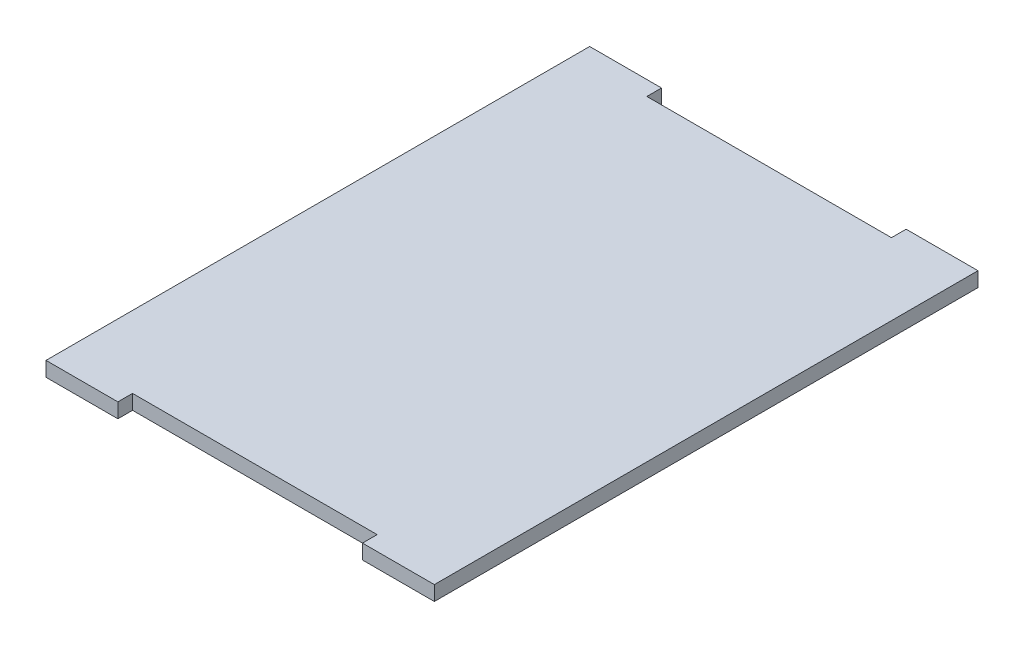
ISO-10303-21;
HEADER;
FILE_DESCRIPTION(('STEP AP214'),'2;1');
FILE_NAME('part.step','',(''),(''),'','','');
FILE_SCHEMA(('AUTOMOTIVE_DESIGN { 1 0 10303 214 1 1 1 1 }'));
ENDSEC;
DATA;
#1=APPLICATION_CONTEXT('core data for automotive mechanical design processes');
#2=APPLICATION_PROTOCOL_DEFINITION('international standard','automotive_design',2000,#1);
#3=PRODUCT_CONTEXT('',#1,'mechanical');
#4=PRODUCT('Part','Part','',(#3));
#5=PRODUCT_RELATED_PRODUCT_CATEGORY('part','',(#4));
#6=PRODUCT_DEFINITION_FORMATION('','',#4);
#7=PRODUCT_DEFINITION_CONTEXT('part definition',#1,'design');
#8=PRODUCT_DEFINITION('design','',#6,#7);
#9=PRODUCT_DEFINITION_SHAPE('','',#8);
#10=(LENGTH_UNIT() NAMED_UNIT(*) SI_UNIT(.MILLI.,.METRE.));
#11=(NAMED_UNIT(*) PLANE_ANGLE_UNIT() SI_UNIT($,.RADIAN.));
#12=(NAMED_UNIT(*) SI_UNIT($,.STERADIAN.) SOLID_ANGLE_UNIT());
#13=UNCERTAINTY_MEASURE_WITH_UNIT(LENGTH_MEASURE(1.E-05),#10,'distance_accuracy_value','');
#14=(GEOMETRIC_REPRESENTATION_CONTEXT(3) GLOBAL_UNCERTAINTY_ASSIGNED_CONTEXT((#13)) GLOBAL_UNIT_ASSIGNED_CONTEXT((#10,
#11,#12)) REPRESENTATION_CONTEXT('',''));
#15=CARTESIAN_POINT('',(0.,0.,0.));
#16=DIRECTION('',(0.,0.,1.));
#17=DIRECTION('',(1.,0.,0.));
#18=AXIS2_PLACEMENT_3D('',#15,#16,#17);
#19=CARTESIAN_POINT('',(25.,3.,-55.565));
#20=DIRECTION('',(0.,0.,1.));
#21=DIRECTION('',(1.,0.,0.));
#22=AXIS2_PLACEMENT_3D('',#19,#20,#21);
#23=PLANE('',#22);
#24=DIRECTION('',(-1.,0.,0.));
#25=VECTOR('',#24,1.);
#26=CARTESIAN_POINT('',(25.,0.,-55.565));
#27=LINE('',#26,#25);
#28=CARTESIAN_POINT('',(39.69,0.,-55.565));
#29=VERTEX_POINT('',#28);
#30=CARTESIAN_POINT('',(25.,0.,-55.565));
#31=VERTEX_POINT('',#30);
#32=EDGE_CURVE('E152',#29,#31,#27,.T.);
#33=ORIENTED_EDGE('',*,*,#32,.T.);
#34=DIRECTION('',(0.,-1.,0.));
#35=VECTOR('',#34,1.);
#36=CARTESIAN_POINT('',(25.,3.,-55.565));
#37=LINE('',#36,#35);
#38=CARTESIAN_POINT('',(25.,3.,-55.565));
#39=VERTEX_POINT('',#38);
#40=EDGE_CURVE('E11',#39,#31,#37,.T.);
#41=ORIENTED_EDGE('',*,*,#40,.F.);
#42=DIRECTION('',(-1.,0.,0.));
#43=VECTOR('',#42,1.);
#44=CARTESIAN_POINT('',(25.,3.,-55.565));
#45=LINE('',#44,#43);
#46=CARTESIAN_POINT('',(39.69,3.,-55.565));
#47=VERTEX_POINT('',#46);
#48=EDGE_CURVE('E174',#47,#39,#45,.T.);
#49=ORIENTED_EDGE('',*,*,#48,.F.);
#50=DIRECTION('',(0.,-1.,0.));
#51=VECTOR('',#50,1.);
#52=CARTESIAN_POINT('',(39.69,3.,-55.565));
#53=LINE('',#52,#51);
#54=EDGE_CURVE('E148',#47,#29,#53,.T.);
#55=ORIENTED_EDGE('',*,*,#54,.T.);
#56=EDGE_LOOP('',(#33,#41,#49,#55));
#57=FACE_BOUND('',#56,.T.);
#58=ADVANCED_FACE('F32',(#57),#23,.F.);
#59=CARTESIAN_POINT('',(25.,3.,-52.565));
#60=DIRECTION('',(1.,0.,0.));
#61=DIRECTION('',(0.,0.,-1.));
#62=AXIS2_PLACEMENT_3D('',#59,#60,#61);
#63=PLANE('',#62);
#64=DIRECTION('',(0.,0.,1.));
#65=VECTOR('',#64,1.);
#66=CARTESIAN_POINT('',(25.,0.,-52.565));
#67=LINE('',#66,#65);
#68=CARTESIAN_POINT('',(25.,0.,-52.565));
#69=VERTEX_POINT('',#68);
#70=EDGE_CURVE('E155',#31,#69,#67,.T.);
#71=ORIENTED_EDGE('',*,*,#70,.T.);
#72=DIRECTION('',(0.,-1.,0.));
#73=VECTOR('',#72,1.);
#74=CARTESIAN_POINT('',(25.,3.,-52.565));
#75=LINE('',#74,#73);
#76=CARTESIAN_POINT('',(25.,3.,-52.565));
#77=VERTEX_POINT('',#76);
#78=EDGE_CURVE('E40',#77,#69,#75,.T.);
#79=ORIENTED_EDGE('',*,*,#78,.F.);
#80=DIRECTION('',(0.,0.,1.));
#81=VECTOR('',#80,1.);
#82=CARTESIAN_POINT('',(25.,3.,-52.565));
#83=LINE('',#82,#81);
#84=EDGE_CURVE('E103',#39,#77,#83,.T.);
#85=ORIENTED_EDGE('',*,*,#84,.F.);
#86=ORIENTED_EDGE('',*,*,#40,.T.);
#87=EDGE_LOOP('',(#71,#79,#85,#86));
#88=FACE_BOUND('',#87,.T.);
#89=ADVANCED_FACE('F252',(#88),#63,.F.);
#90=CARTESIAN_POINT('',(-25.,3.,-52.565));
#91=DIRECTION('',(0.,0.,1.));
#92=DIRECTION('',(1.,0.,0.));
#93=AXIS2_PLACEMENT_3D('',#90,#91,#92);
#94=PLANE('',#93);
#95=DIRECTION('',(-1.,0.,0.));
#96=VECTOR('',#95,1.);
#97=CARTESIAN_POINT('',(-25.,0.,-52.565));
#98=LINE('',#97,#96);
#99=CARTESIAN_POINT('',(-25.,0.,-52.565));
#100=VERTEX_POINT('',#99);
#101=EDGE_CURVE('E157',#69,#100,#98,.T.);
#102=ORIENTED_EDGE('',*,*,#101,.T.);
#103=DIRECTION('',(0.,-1.,0.));
#104=VECTOR('',#103,1.);
#105=CARTESIAN_POINT('',(-25.,3.,-52.565));
#106=LINE('',#105,#104);
#107=CARTESIAN_POINT('',(-25.,3.,-52.565));
#108=VERTEX_POINT('',#107);
#109=EDGE_CURVE('E193',#108,#100,#106,.T.);
#110=ORIENTED_EDGE('',*,*,#109,.F.);
#111=DIRECTION('',(-1.,0.,0.));
#112=VECTOR('',#111,1.);
#113=CARTESIAN_POINT('',(-25.,3.,-52.565));
#114=LINE('',#113,#112);
#115=EDGE_CURVE('E201',#77,#108,#114,.T.);
#116=ORIENTED_EDGE('',*,*,#115,.F.);
#117=ORIENTED_EDGE('',*,*,#78,.T.);
#118=EDGE_LOOP('',(#102,#110,#116,#117));
#119=FACE_BOUND('',#118,.T.);
#120=ADVANCED_FACE('F199',(#119),#94,.F.);
#121=CARTESIAN_POINT('',(-25.,3.,-55.565));
#122=DIRECTION('',(-1.,0.,0.));
#123=DIRECTION('',(0.,0.,1.));
#124=AXIS2_PLACEMENT_3D('',#121,#122,#123);
#125=PLANE('',#124);
#126=DIRECTION('',(0.,0.,-1.));
#127=VECTOR('',#126,1.);
#128=CARTESIAN_POINT('',(-25.,0.,-55.565));
#129=LINE('',#128,#127);
#130=CARTESIAN_POINT('',(-25.,0.,-55.565));
#131=VERTEX_POINT('',#130);
#132=EDGE_CURVE('E159',#100,#131,#129,.T.);
#133=ORIENTED_EDGE('',*,*,#132,.T.);
#134=DIRECTION('',(0.,-1.,0.));
#135=VECTOR('',#134,1.);
#136=CARTESIAN_POINT('',(-25.,3.,-55.565));
#137=LINE('',#136,#135);
#138=CARTESIAN_POINT('',(-25.,3.,-55.565));
#139=VERTEX_POINT('',#138);
#140=EDGE_CURVE('E190',#139,#131,#137,.T.);
#141=ORIENTED_EDGE('',*,*,#140,.F.);
#142=DIRECTION('',(0.,0.,-1.));
#143=VECTOR('',#142,1.);
#144=CARTESIAN_POINT('',(-25.,3.,-55.565));
#145=LINE('',#144,#143);
#146=EDGE_CURVE('E219',#108,#139,#145,.T.);
#147=ORIENTED_EDGE('',*,*,#146,.F.);
#148=ORIENTED_EDGE('',*,*,#109,.T.);
#149=EDGE_LOOP('',(#133,#141,#147,#148));
#150=FACE_BOUND('',#149,.T.);
#151=ADVANCED_FACE('F210',(#150),#125,.F.);
#152=CARTESIAN_POINT('',(-39.69,3.,-55.565));
#153=DIRECTION('',(0.,0.,1.));
#154=DIRECTION('',(1.,0.,0.));
#155=AXIS2_PLACEMENT_3D('',#152,#153,#154);
#156=PLANE('',#155);
#157=DIRECTION('',(-1.,0.,0.));
#158=VECTOR('',#157,1.);
#159=CARTESIAN_POINT('',(-39.69,0.,-55.565));
#160=LINE('',#159,#158);
#161=CARTESIAN_POINT('',(-39.69,0.,-55.565));
#162=VERTEX_POINT('',#161);
#163=EDGE_CURVE('E161',#131,#162,#160,.T.);
#164=ORIENTED_EDGE('',*,*,#163,.T.);
#165=DIRECTION('',(0.,-1.,0.));
#166=VECTOR('',#165,1.);
#167=CARTESIAN_POINT('',(-39.69,3.,-55.565));
#168=LINE('',#167,#166);
#169=CARTESIAN_POINT('',(-39.69,3.,-55.565));
#170=VERTEX_POINT('',#169);
#171=EDGE_CURVE('E187',#170,#162,#168,.T.);
#172=ORIENTED_EDGE('',*,*,#171,.F.);
#173=DIRECTION('',(-1.,0.,0.));
#174=VECTOR('',#173,1.);
#175=CARTESIAN_POINT('',(-39.69,3.,-55.565));
#176=LINE('',#175,#174);
#177=EDGE_CURVE('E216',#139,#170,#176,.T.);
#178=ORIENTED_EDGE('',*,*,#177,.F.);
#179=ORIENTED_EDGE('',*,*,#140,.T.);
#180=EDGE_LOOP('',(#164,#172,#178,#179));
#181=FACE_BOUND('',#180,.T.);
#182=ADVANCED_FACE('F214',(#181),#156,.F.);
#183=CARTESIAN_POINT('',(-39.69,3.,55.565));
#184=DIRECTION('',(1.,0.,0.));
#185=DIRECTION('',(0.,0.,-1.));
#186=AXIS2_PLACEMENT_3D('',#183,#184,#185);
#187=PLANE('',#186);
#188=DIRECTION('',(0.,0.,1.));
#189=VECTOR('',#188,1.);
#190=CARTESIAN_POINT('',(-39.69,0.,55.565));
#191=LINE('',#190,#189);
#192=CARTESIAN_POINT('',(-39.69,0.,55.565));
#193=VERTEX_POINT('',#192);
#194=EDGE_CURVE('E163',#162,#193,#191,.T.);
#195=ORIENTED_EDGE('',*,*,#194,.T.);
#196=DIRECTION('',(0.,-1.,0.));
#197=VECTOR('',#196,1.);
#198=CARTESIAN_POINT('',(-39.69,3.,55.565));
#199=LINE('',#198,#197);
#200=CARTESIAN_POINT('',(-39.69,3.,55.565));
#201=VERTEX_POINT('',#200);
#202=EDGE_CURVE('E184',#201,#193,#199,.T.);
#203=ORIENTED_EDGE('',*,*,#202,.F.);
#204=DIRECTION('',(0.,0.,1.));
#205=VECTOR('',#204,1.);
#206=CARTESIAN_POINT('',(-39.69,3.,55.565));
#207=LINE('',#206,#205);
#208=EDGE_CURVE('E218',#170,#201,#207,.T.);
#209=ORIENTED_EDGE('',*,*,#208,.F.);
#210=ORIENTED_EDGE('',*,*,#171,.T.);
#211=EDGE_LOOP('',(#195,#203,#209,#210));
#212=FACE_BOUND('',#211,.T.);
#213=ADVANCED_FACE('F265',(#212),#187,.F.);
#214=CARTESIAN_POINT('',(-39.69,3.,55.565));
#215=DIRECTION('',(0.,0.,-1.));
#216=DIRECTION('',(-1.,0.,0.));
#217=AXIS2_PLACEMENT_3D('',#214,#215,#216);
#218=PLANE('',#217);
#219=DIRECTION('',(1.,0.,0.));
#220=VECTOR('',#219,1.);
#221=CARTESIAN_POINT('',(-39.69,0.,55.565));
#222=LINE('',#221,#220);
#223=CARTESIAN_POINT('',(-25.,0.,55.565));
#224=VERTEX_POINT('',#223);
#225=EDGE_CURVE('E165',#193,#224,#222,.T.);
#226=ORIENTED_EDGE('',*,*,#225,.T.);
#227=DIRECTION('',(0.,-1.,0.));
#228=VECTOR('',#227,1.);
#229=CARTESIAN_POINT('',(-25.,3.,55.565));
#230=LINE('',#229,#228);
#231=CARTESIAN_POINT('',(-25.,3.,55.565));
#232=VERTEX_POINT('',#231);
#233=EDGE_CURVE('E181',#232,#224,#230,.T.);
#234=ORIENTED_EDGE('',*,*,#233,.F.);
#235=DIRECTION('',(1.,0.,0.));
#236=VECTOR('',#235,1.);
#237=CARTESIAN_POINT('',(-39.69,3.,55.565));
#238=LINE('',#237,#236);
#239=EDGE_CURVE('E221',#201,#232,#238,.T.);
#240=ORIENTED_EDGE('',*,*,#239,.F.);
#241=ORIENTED_EDGE('',*,*,#202,.T.);
#242=EDGE_LOOP('',(#226,#234,#240,#241));
#243=FACE_BOUND('',#242,.T.);
#244=ADVANCED_FACE('F268',(#243),#218,.F.);
#245=CARTESIAN_POINT('',(-25.,3.,55.565));
#246=DIRECTION('',(-1.,0.,0.));
#247=DIRECTION('',(0.,0.,1.));
#248=AXIS2_PLACEMENT_3D('',#245,#246,#247);
#249=PLANE('',#248);
#250=DIRECTION('',(0.,0.,-1.));
#251=VECTOR('',#250,1.);
#252=CARTESIAN_POINT('',(-25.,0.,55.565));
#253=LINE('',#252,#251);
#254=CARTESIAN_POINT('',(-25.,0.,52.565));
#255=VERTEX_POINT('',#254);
#256=EDGE_CURVE('E167',#224,#255,#253,.T.);
#257=ORIENTED_EDGE('',*,*,#256,.T.);
#258=DIRECTION('',(0.,-1.,0.));
#259=VECTOR('',#258,1.);
#260=CARTESIAN_POINT('',(-25.,3.,52.565));
#261=LINE('',#260,#259);
#262=CARTESIAN_POINT('',(-25.,3.,52.565));
#263=VERTEX_POINT('',#262);
#264=EDGE_CURVE('E178',#263,#255,#261,.T.);
#265=ORIENTED_EDGE('',*,*,#264,.F.);
#266=DIRECTION('',(0.,0.,-1.));
#267=VECTOR('',#266,1.);
#268=CARTESIAN_POINT('',(-25.,3.,55.565));
#269=LINE('',#268,#267);
#270=EDGE_CURVE('E227',#232,#263,#269,.T.);
#271=ORIENTED_EDGE('',*,*,#270,.F.);
#272=ORIENTED_EDGE('',*,*,#233,.T.);
#273=EDGE_LOOP('',(#257,#265,#271,#272));
#274=FACE_BOUND('',#273,.T.);
#275=ADVANCED_FACE('F233',(#274),#249,.F.);
#276=CARTESIAN_POINT('',(-25.,3.,52.565));
#277=DIRECTION('',(0.,0.,-1.));
#278=DIRECTION('',(-1.,0.,0.));
#279=AXIS2_PLACEMENT_3D('',#276,#277,#278);
#280=PLANE('',#279);
#281=DIRECTION('',(1.,0.,0.));
#282=VECTOR('',#281,1.);
#283=CARTESIAN_POINT('',(-25.,0.,52.565));
#284=LINE('',#283,#282);
#285=CARTESIAN_POINT('',(25.,0.,52.565));
#286=VERTEX_POINT('',#285);
#287=EDGE_CURVE('E169',#255,#286,#284,.T.);
#288=ORIENTED_EDGE('',*,*,#287,.T.);
#289=DIRECTION('',(0.,-1.,0.));
#290=VECTOR('',#289,1.);
#291=CARTESIAN_POINT('',(25.,3.,52.565));
#292=LINE('',#291,#290);
#293=CARTESIAN_POINT('',(25.,3.,52.565));
#294=VERTEX_POINT('',#293);
#295=EDGE_CURVE('E143',#294,#286,#292,.T.);
#296=ORIENTED_EDGE('',*,*,#295,.F.);
#297=DIRECTION('',(1.,0.,0.));
#298=VECTOR('',#297,1.);
#299=CARTESIAN_POINT('',(-25.,3.,52.565));
#300=LINE('',#299,#298);
#301=EDGE_CURVE('E134',#263,#294,#300,.T.);
#302=ORIENTED_EDGE('',*,*,#301,.F.);
#303=ORIENTED_EDGE('',*,*,#264,.T.);
#304=EDGE_LOOP('',(#288,#296,#302,#303));
#305=FACE_BOUND('',#304,.T.);
#306=ADVANCED_FACE('F237',(#305),#280,.F.);
#307=CARTESIAN_POINT('',(25.,3.,52.565));
#308=DIRECTION('',(1.,0.,0.));
#309=DIRECTION('',(0.,0.,-1.));
#310=AXIS2_PLACEMENT_3D('',#307,#308,#309);
#311=PLANE('',#310);
#312=DIRECTION('',(0.,0.,1.));
#313=VECTOR('',#312,1.);
#314=CARTESIAN_POINT('',(25.,0.,52.565));
#315=LINE('',#314,#313);
#316=CARTESIAN_POINT('',(25.,0.,55.565));
#317=VERTEX_POINT('',#316);
#318=EDGE_CURVE('E142',#286,#317,#315,.T.);
#319=ORIENTED_EDGE('',*,*,#318,.T.);
#320=DIRECTION('',(0.,-1.,0.));
#321=VECTOR('',#320,1.);
#322=CARTESIAN_POINT('',(25.,3.,55.565));
#323=LINE('',#322,#321);
#324=CARTESIAN_POINT('',(25.,3.,55.565));
#325=VERTEX_POINT('',#324);
#326=EDGE_CURVE('E139',#325,#317,#323,.T.);
#327=ORIENTED_EDGE('',*,*,#326,.F.);
#328=DIRECTION('',(0.,0.,1.));
#329=VECTOR('',#328,1.);
#330=CARTESIAN_POINT('',(25.,3.,52.565));
#331=LINE('',#330,#329);
#332=EDGE_CURVE('E128',#294,#325,#331,.T.);
#333=ORIENTED_EDGE('',*,*,#332,.F.);
#334=ORIENTED_EDGE('',*,*,#295,.T.);
#335=EDGE_LOOP('',(#319,#327,#333,#334));
#336=FACE_BOUND('',#335,.T.);
#337=ADVANCED_FACE('F140',(#336),#311,.F.);
#338=CARTESIAN_POINT('',(25.,3.,55.565));
#339=DIRECTION('',(0.,0.,-1.));
#340=DIRECTION('',(-1.,0.,0.));
#341=AXIS2_PLACEMENT_3D('',#338,#339,#340);
#342=PLANE('',#341);
#343=DIRECTION('',(1.,0.,0.));
#344=VECTOR('',#343,1.);
#345=CARTESIAN_POINT('',(25.,0.,55.565));
#346=LINE('',#345,#344);
#347=CARTESIAN_POINT('',(39.69,0.,55.565));
#348=VERTEX_POINT('',#347);
#349=EDGE_CURVE('E89',#317,#348,#346,.T.);
#350=ORIENTED_EDGE('',*,*,#349,.T.);
#351=DIRECTION('',(0.,-1.,0.));
#352=VECTOR('',#351,1.);
#353=CARTESIAN_POINT('',(39.69,3.,55.565));
#354=LINE('',#353,#352);
#355=CARTESIAN_POINT('',(39.69,3.,55.565));
#356=VERTEX_POINT('',#355);
#357=EDGE_CURVE('E144',#356,#348,#354,.T.);
#358=ORIENTED_EDGE('',*,*,#357,.F.);
#359=DIRECTION('',(1.,0.,0.));
#360=VECTOR('',#359,1.);
#361=CARTESIAN_POINT('',(25.,3.,55.565));
#362=LINE('',#361,#360);
#363=EDGE_CURVE('E132',#325,#356,#362,.T.);
#364=ORIENTED_EDGE('',*,*,#363,.F.);
#365=ORIENTED_EDGE('',*,*,#326,.T.);
#366=EDGE_LOOP('',(#350,#358,#364,#365));
#367=FACE_BOUND('',#366,.T.);
#368=ADVANCED_FACE('F146',(#367),#342,.F.);
#369=CARTESIAN_POINT('',(39.69,3.,55.565));
#370=DIRECTION('',(-1.,0.,0.));
#371=DIRECTION('',(0.,0.,1.));
#372=AXIS2_PLACEMENT_3D('',#369,#370,#371);
#373=PLANE('',#372);
#374=DIRECTION('',(0.,0.,-1.));
#375=VECTOR('',#374,1.);
#376=CARTESIAN_POINT('',(39.69,0.,55.565));
#377=LINE('',#376,#375);
#378=EDGE_CURVE('E95',#348,#29,#377,.T.);
#379=ORIENTED_EDGE('',*,*,#378,.T.);
#380=ORIENTED_EDGE('',*,*,#54,.F.);
#381=DIRECTION('',(0.,0.,-1.));
#382=VECTOR('',#381,1.);
#383=CARTESIAN_POINT('',(39.69,3.,55.565));
#384=LINE('',#383,#382);
#385=EDGE_CURVE('E48',#356,#47,#384,.T.);
#386=ORIENTED_EDGE('',*,*,#385,.F.);
#387=ORIENTED_EDGE('',*,*,#357,.T.);
#388=EDGE_LOOP('',(#379,#380,#386,#387));
#389=FACE_BOUND('',#388,.T.);
#390=ADVANCED_FACE('F241',(#389),#373,.F.);
#391=CARTESIAN_POINT('',(0.,3.,0.));
#392=DIRECTION('',(0.,1.,0.));
#393=DIRECTION('',(0.,0.,1.));
#394=AXIS2_PLACEMENT_3D('',#391,#392,#393);
#395=PLANE('',#394);
#396=ORIENTED_EDGE('',*,*,#48,.T.);
#397=ORIENTED_EDGE('',*,*,#84,.T.);
#398=ORIENTED_EDGE('',*,*,#115,.T.);
#399=ORIENTED_EDGE('',*,*,#146,.T.);
#400=ORIENTED_EDGE('',*,*,#177,.T.);
#401=ORIENTED_EDGE('',*,*,#208,.T.);
#402=ORIENTED_EDGE('',*,*,#239,.T.);
#403=ORIENTED_EDGE('',*,*,#270,.T.);
#404=ORIENTED_EDGE('',*,*,#301,.T.);
#405=ORIENTED_EDGE('',*,*,#332,.T.);
#406=ORIENTED_EDGE('',*,*,#363,.T.);
#407=ORIENTED_EDGE('',*,*,#385,.T.);
#408=EDGE_LOOP('',(#396,#397,#398,#399,#400,#401,#402,#403,#404,#405,#406,#407));
#409=FACE_BOUND('',#408,.T.);
#410=ADVANCED_FACE('F130',(#409),#395,.T.);
#411=CARTESIAN_POINT('',(0.,0.,0.));
#412=DIRECTION('',(0.,1.,0.));
#413=DIRECTION('',(0.,0.,1.));
#414=AXIS2_PLACEMENT_3D('',#411,#412,#413);
#415=PLANE('',#414);
#416=ORIENTED_EDGE('',*,*,#32,.F.);
#417=ORIENTED_EDGE('',*,*,#378,.F.);
#418=ORIENTED_EDGE('',*,*,#349,.F.);
#419=ORIENTED_EDGE('',*,*,#318,.F.);
#420=ORIENTED_EDGE('',*,*,#287,.F.);
#421=ORIENTED_EDGE('',*,*,#256,.F.);
#422=ORIENTED_EDGE('',*,*,#225,.F.);
#423=ORIENTED_EDGE('',*,*,#194,.F.);
#424=ORIENTED_EDGE('',*,*,#163,.F.);
#425=ORIENTED_EDGE('',*,*,#132,.F.);
#426=ORIENTED_EDGE('',*,*,#101,.F.);
#427=ORIENTED_EDGE('',*,*,#70,.F.);
#428=EDGE_LOOP('',(#416,#417,#418,#419,#420,#421,#422,#423,#424,#425,#426,#427));
#429=FACE_BOUND('',#428,.T.);
#430=ADVANCED_FACE('F205',(#429),#415,.F.);
#431=CLOSED_SHELL('',(#58,#89,#120,#151,#182,#213,#244,#275,#306,#337,#368,#390,#410,#430));
#432=MANIFOLD_SOLID_BREP('B2',#431);
#433=ADVANCED_BREP_SHAPE_REPRESENTATION('',(#18,#432),#14);
#434=SHAPE_DEFINITION_REPRESENTATION(#9,#433);
ENDSEC;
END-ISO-10303-21;
